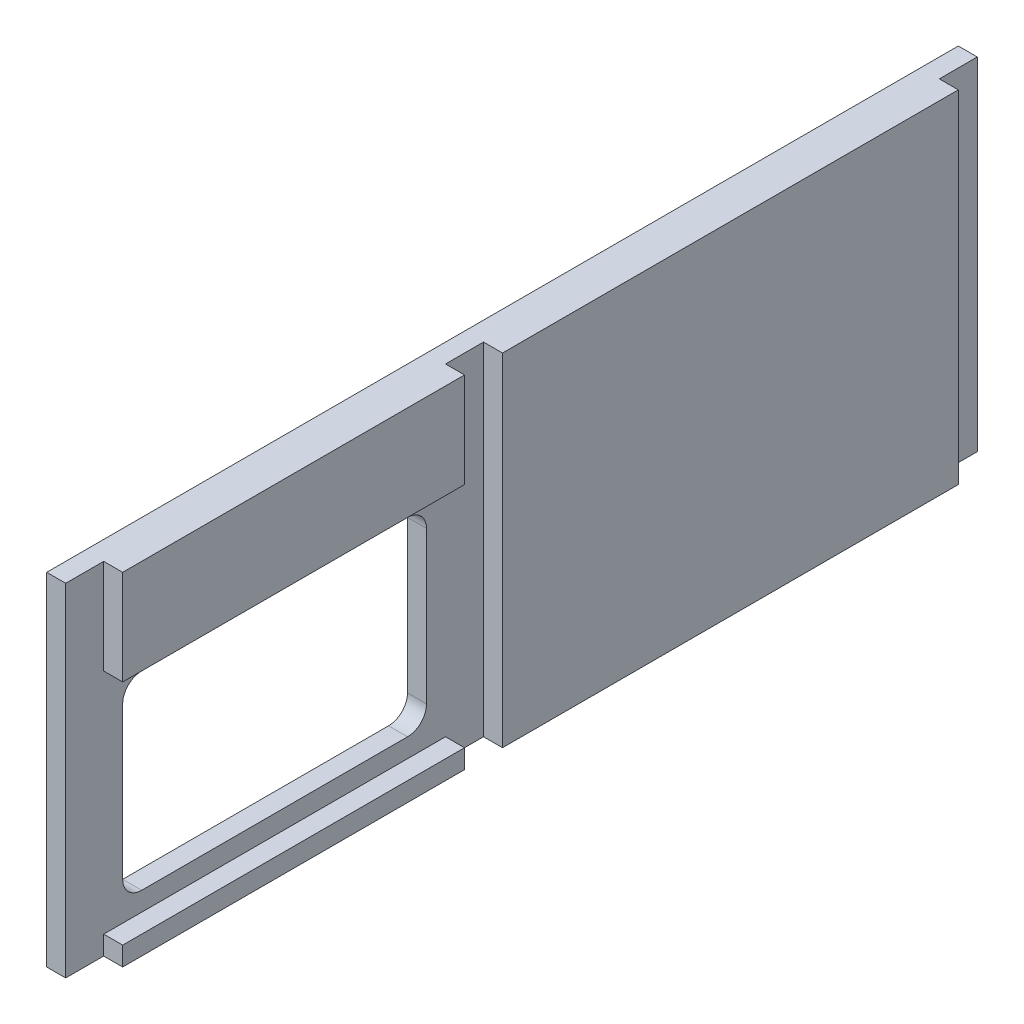
ISO-10303-21;
HEADER;
FILE_DESCRIPTION(('STEP AP214'),'2;1');
FILE_NAME('part.step','',(''),(''),'','','');
FILE_SCHEMA(('AUTOMOTIVE_DESIGN { 1 0 10303 214 1 1 1 1 }'));
ENDSEC;
DATA;
#1=APPLICATION_CONTEXT('core data for automotive mechanical design processes');
#2=APPLICATION_PROTOCOL_DEFINITION('international standard','automotive_design',2000,#1);
#3=PRODUCT_CONTEXT('',#1,'mechanical');
#4=PRODUCT('Part','Part','',(#3));
#5=PRODUCT_RELATED_PRODUCT_CATEGORY('part','',(#4));
#6=PRODUCT_DEFINITION_FORMATION('','',#4);
#7=PRODUCT_DEFINITION_CONTEXT('part definition',#1,'design');
#8=PRODUCT_DEFINITION('design','',#6,#7);
#9=PRODUCT_DEFINITION_SHAPE('','',#8);
#10=(LENGTH_UNIT() NAMED_UNIT(*) SI_UNIT(.MILLI.,.METRE.));
#11=(NAMED_UNIT(*) PLANE_ANGLE_UNIT() SI_UNIT($,.RADIAN.));
#12=(NAMED_UNIT(*) SI_UNIT($,.STERADIAN.) SOLID_ANGLE_UNIT());
#13=UNCERTAINTY_MEASURE_WITH_UNIT(LENGTH_MEASURE(1.E-05),#10,'distance_accuracy_value','');
#14=(GEOMETRIC_REPRESENTATION_CONTEXT(3) GLOBAL_UNCERTAINTY_ASSIGNED_CONTEXT((#13)) GLOBAL_UNIT_ASSIGNED_CONTEXT((#10,
#11,#12)) REPRESENTATION_CONTEXT('',''));
#15=CARTESIAN_POINT('',(0.,0.,0.));
#16=DIRECTION('',(0.,0.,1.));
#17=DIRECTION('',(1.,0.,0.));
#18=AXIS2_PLACEMENT_3D('',#15,#16,#17);
#19=CARTESIAN_POINT('',(12.7,0.,0.));
#20=DIRECTION('',(-1.,0.,0.));
#21=DIRECTION('',(0.,0.,1.));
#22=AXIS2_PLACEMENT_3D('',#19,#20,#21);
#23=PLANE('',#22);
#24=DIRECTION('',(0.,1.,0.));
#25=VECTOR('',#24,1.);
#26=CARTESIAN_POINT('',(12.7,114.3,-12.7));
#27=LINE('',#26,#25);
#28=CARTESIAN_POINT('',(12.7,82.55,-12.7));
#29=VERTEX_POINT('',#28);
#30=CARTESIAN_POINT('',(12.7,114.3,-12.7));
#31=VERTEX_POINT('',#30);
#32=EDGE_CURVE('E355',#29,#31,#27,.T.);
#33=ORIENTED_EDGE('',*,*,#32,.F.);
#34=DIRECTION('',(0.,0.,1.));
#35=VECTOR('',#34,1.);
#36=CARTESIAN_POINT('',(12.7,82.55,-12.7));
#37=LINE('',#36,#35);
#38=CARTESIAN_POINT('',(12.7,82.55,-127.));
#39=VERTEX_POINT('',#38);
#40=EDGE_CURVE('E272',#39,#29,#37,.T.);
#41=ORIENTED_EDGE('',*,*,#40,.F.);
#42=DIRECTION('',(0.,-1.,0.));
#43=VECTOR('',#42,1.);
#44=CARTESIAN_POINT('',(12.7,114.3,-127.));
#45=LINE('',#44,#43);
#46=CARTESIAN_POINT('',(12.7,114.3,-127.));
#47=VERTEX_POINT('',#46);
#48=EDGE_CURVE('E404',#47,#39,#45,.T.);
#49=ORIENTED_EDGE('',*,*,#48,.F.);
#50=DIRECTION('',(0.,0.,1.));
#51=VECTOR('',#50,1.);
#52=CARTESIAN_POINT('',(12.7,114.3,0.));
#53=LINE('',#52,#51);
#54=EDGE_CURVE('E288',#47,#31,#53,.T.);
#55=ORIENTED_EDGE('',*,*,#54,.T.);
#56=EDGE_LOOP('',(#33,#41,#49,#55));
#57=FACE_BOUND('',#56,.T.);
#58=ADVANCED_FACE('F40',(#57),#23,.F.);
#59=CARTESIAN_POINT('',(6.35,114.3,-12.7));
#60=DIRECTION('',(0.,0.,-1.));
#61=DIRECTION('',(0.,1.,0.));
#62=AXIS2_PLACEMENT_3D('',#59,#60,#61);
#63=PLANE('',#62);
#64=DIRECTION('',(0.,1.,0.));
#65=VECTOR('',#64,1.);
#66=CARTESIAN_POINT('',(6.35,114.3,-12.7));
#67=LINE('',#66,#65);
#68=CARTESIAN_POINT('',(6.35,82.55,-12.7));
#69=VERTEX_POINT('',#68);
#70=CARTESIAN_POINT('',(6.35,114.3,-12.7));
#71=VERTEX_POINT('',#70);
#72=EDGE_CURVE('E363',#69,#71,#67,.T.);
#73=ORIENTED_EDGE('',*,*,#72,.F.);
#74=DIRECTION('',(1.,0.,0.));
#75=VECTOR('',#74,1.);
#76=CARTESIAN_POINT('',(6.35,82.55,-12.7));
#77=LINE('',#76,#75);
#78=EDGE_CURVE('E279',#69,#29,#77,.T.);
#79=ORIENTED_EDGE('',*,*,#78,.T.);
#80=ORIENTED_EDGE('',*,*,#32,.T.);
#81=DIRECTION('',(1.,0.,0.));
#82=VECTOR('',#81,1.);
#83=CARTESIAN_POINT('',(6.35,114.3,-12.7));
#84=LINE('',#83,#82);
#85=EDGE_CURVE('E300',#71,#31,#84,.T.);
#86=ORIENTED_EDGE('',*,*,#85,.F.);
#87=EDGE_LOOP('',(#73,#79,#80,#86));
#88=FACE_BOUND('',#87,.T.);
#89=ADVANCED_FACE('F442',(#88),#63,.F.);
#90=CARTESIAN_POINT('',(6.35,114.3,-127.));
#91=DIRECTION('',(0.,0.,1.));
#92=DIRECTION('',(1.,0.,0.));
#93=AXIS2_PLACEMENT_3D('',#90,#91,#92);
#94=PLANE('',#93);
#95=ORIENTED_EDGE('',*,*,#48,.T.);
#96=DIRECTION('',(1.,0.,0.));
#97=VECTOR('',#96,1.);
#98=CARTESIAN_POINT('',(6.35,82.55,-127.));
#99=LINE('',#98,#97);
#100=CARTESIAN_POINT('',(6.35,82.55,-127.));
#101=VERTEX_POINT('',#100);
#102=EDGE_CURVE('E417',#101,#39,#99,.T.);
#103=ORIENTED_EDGE('',*,*,#102,.F.);
#104=DIRECTION('',(0.,-1.,0.));
#105=VECTOR('',#104,1.);
#106=CARTESIAN_POINT('',(6.35,114.3,-127.));
#107=LINE('',#106,#105);
#108=CARTESIAN_POINT('',(6.35,114.3,-127.));
#109=VERTEX_POINT('',#108);
#110=EDGE_CURVE('E411',#109,#101,#107,.T.);
#111=ORIENTED_EDGE('',*,*,#110,.F.);
#112=DIRECTION('',(1.,0.,0.));
#113=VECTOR('',#112,1.);
#114=CARTESIAN_POINT('',(6.35,114.3,-127.));
#115=LINE('',#114,#113);
#116=EDGE_CURVE('E351',#109,#47,#115,.T.);
#117=ORIENTED_EDGE('',*,*,#116,.T.);
#118=EDGE_LOOP('',(#95,#103,#111,#117));
#119=FACE_BOUND('',#118,.T.);
#120=ADVANCED_FACE('F438',(#119),#94,.F.);
#121=CARTESIAN_POINT('',(12.7,6.35,-127.));
#122=VERTEX_POINT('',#121);
#123=CARTESIAN_POINT('',(12.7,0.,-127.));
#124=VERTEX_POINT('',#123);
#125=EDGE_CURVE('E406',#122,#124,#45,.T.);
#126=ORIENTED_EDGE('',*,*,#125,.F.);
#127=DIRECTION('',(0.,0.,-1.));
#128=VECTOR('',#127,1.);
#129=CARTESIAN_POINT('',(12.7,6.35,-12.7));
#130=LINE('',#129,#128);
#131=CARTESIAN_POINT('',(12.7,6.35,-12.7));
#132=VERTEX_POINT('',#131);
#133=EDGE_CURVE('E257',#132,#122,#130,.T.);
#134=ORIENTED_EDGE('',*,*,#133,.F.);
#135=CARTESIAN_POINT('',(12.7,0.,-12.7));
#136=VERTEX_POINT('',#135);
#137=EDGE_CURVE('E360',#136,#132,#27,.T.);
#138=ORIENTED_EDGE('',*,*,#137,.F.);
#139=DIRECTION('',(0.,0.,-1.));
#140=VECTOR('',#139,1.);
#141=CARTESIAN_POINT('',(12.7,0.,0.));
#142=LINE('',#141,#140);
#143=EDGE_CURVE('E283',#136,#124,#142,.T.);
#144=ORIENTED_EDGE('',*,*,#143,.T.);
#145=EDGE_LOOP('',(#126,#134,#138,#144));
#146=FACE_BOUND('',#145,.T.);
#147=ADVANCED_FACE('F381',(#146),#23,.F.);
#148=CARTESIAN_POINT('',(12.7,0.,0.));
#149=DIRECTION('',(0.,0.,-1.));
#150=DIRECTION('',(-1.,0.,0.));
#151=AXIS2_PLACEMENT_3D('',#148,#149,#150);
#152=PLANE('',#151);
#153=DIRECTION('',(0.,-1.,0.));
#154=VECTOR('',#153,1.);
#155=CARTESIAN_POINT('',(6.35,114.3,0.));
#156=LINE('',#155,#154);
#157=CARTESIAN_POINT('',(6.35,114.3,0.));
#158=VERTEX_POINT('',#157);
#159=CARTESIAN_POINT('',(6.35,0.,0.));
#160=VERTEX_POINT('',#159);
#161=EDGE_CURVE('E357',#158,#160,#156,.T.);
#162=ORIENTED_EDGE('',*,*,#161,.F.);
#163=DIRECTION('',(-1.,0.,0.));
#164=VECTOR('',#163,1.);
#165=CARTESIAN_POINT('',(12.7,114.3,0.));
#166=LINE('',#165,#164);
#167=CARTESIAN_POINT('',(0.,114.3,0.));
#168=VERTEX_POINT('',#167);
#169=EDGE_CURVE('E295',#158,#168,#166,.T.);
#170=ORIENTED_EDGE('',*,*,#169,.T.);
#171=DIRECTION('',(0.,-1.,0.));
#172=VECTOR('',#171,1.);
#173=CARTESIAN_POINT('',(0.,0.,0.));
#174=LINE('',#173,#172);
#175=CARTESIAN_POINT('',(0.,0.,0.));
#176=VERTEX_POINT('',#175);
#177=EDGE_CURVE('E296',#168,#176,#174,.T.);
#178=ORIENTED_EDGE('',*,*,#177,.T.);
#179=DIRECTION('',(-1.,0.,0.));
#180=VECTOR('',#179,1.);
#181=CARTESIAN_POINT('',(12.7,0.,0.));
#182=LINE('',#181,#180);
#183=EDGE_CURVE('E12',#160,#176,#182,.T.);
#184=ORIENTED_EDGE('',*,*,#183,.F.);
#185=EDGE_LOOP('',(#162,#170,#178,#184));
#186=FACE_BOUND('',#185,.T.);
#187=ADVANCED_FACE('F42',(#186),#152,.F.);
#188=CARTESIAN_POINT('',(12.7,0.,0.));
#189=DIRECTION('',(0.,1.,0.));
#190=DIRECTION('',(0.,0.,1.));
#191=AXIS2_PLACEMENT_3D('',#188,#189,#190);
#192=PLANE('',#191);
#193=DIRECTION('',(0.,0.,-1.));
#194=VECTOR('',#193,1.);
#195=CARTESIAN_POINT('',(6.35,0.,-127.));
#196=LINE('',#195,#194);
#197=CARTESIAN_POINT('',(6.35,0.,-127.));
#198=VERTEX_POINT('',#197);
#199=CARTESIAN_POINT('',(6.35,0.,-139.7));
#200=VERTEX_POINT('',#199);
#201=EDGE_CURVE('E387',#198,#200,#196,.T.);
#202=ORIENTED_EDGE('',*,*,#201,.F.);
#203=DIRECTION('',(1.,0.,0.));
#204=VECTOR('',#203,1.);
#205=CARTESIAN_POINT('',(6.35,0.,-127.));
#206=LINE('',#205,#204);
#207=EDGE_CURVE('E384',#198,#124,#206,.T.);
#208=ORIENTED_EDGE('',*,*,#207,.T.);
#209=ORIENTED_EDGE('',*,*,#143,.F.);
#210=DIRECTION('',(1.,0.,0.));
#211=VECTOR('',#210,1.);
#212=CARTESIAN_POINT('',(6.35,0.,-12.7));
#213=LINE('',#212,#211);
#214=CARTESIAN_POINT('',(6.35,0.,-12.7));
#215=VERTEX_POINT('',#214);
#216=EDGE_CURVE('E290',#215,#136,#213,.T.);
#217=ORIENTED_EDGE('',*,*,#216,.F.);
#218=DIRECTION('',(0.,0.,-1.));
#219=VECTOR('',#218,1.);
#220=CARTESIAN_POINT('',(6.35,0.,0.));
#221=LINE('',#220,#219);
#222=EDGE_CURVE('E359',#160,#215,#221,.T.);
#223=ORIENTED_EDGE('',*,*,#222,.F.);
#224=ORIENTED_EDGE('',*,*,#183,.T.);
#225=DIRECTION('',(0.,0.,-1.));
#226=VECTOR('',#225,1.);
#227=CARTESIAN_POINT('',(0.,0.,0.));
#228=LINE('',#227,#226);
#229=CARTESIAN_POINT('',(0.,0.,-304.8));
#230=VERTEX_POINT('',#229);
#231=EDGE_CURVE('E299',#176,#230,#228,.T.);
#232=ORIENTED_EDGE('',*,*,#231,.T.);
#233=DIRECTION('',(-1.,0.,0.));
#234=VECTOR('',#233,1.);
#235=CARTESIAN_POINT('',(12.7,0.,-304.8));
#236=LINE('',#235,#234);
#237=CARTESIAN_POINT('',(6.35,0.,-304.8));
#238=VERTEX_POINT('',#237);
#239=EDGE_CURVE('E48',#238,#230,#236,.T.);
#240=ORIENTED_EDGE('',*,*,#239,.F.);
#241=DIRECTION('',(0.,0.,-1.));
#242=VECTOR('',#241,1.);
#243=CARTESIAN_POINT('',(6.35,0.,-304.8));
#244=LINE('',#243,#242);
#245=CARTESIAN_POINT('',(6.35,0.,-292.1));
#246=VERTEX_POINT('',#245);
#247=EDGE_CURVE('E342',#246,#238,#244,.T.);
#248=ORIENTED_EDGE('',*,*,#247,.F.);
#249=DIRECTION('',(1.,0.,0.));
#250=VECTOR('',#249,1.);
#251=CARTESIAN_POINT('',(6.35,0.,-292.1));
#252=LINE('',#251,#250);
#253=CARTESIAN_POINT('',(12.7,0.,-292.1));
#254=VERTEX_POINT('',#253);
#255=EDGE_CURVE('E352',#246,#254,#252,.T.);
#256=ORIENTED_EDGE('',*,*,#255,.T.);
#257=CARTESIAN_POINT('',(12.7,0.,-139.7));
#258=VERTEX_POINT('',#257);
#259=EDGE_CURVE('E289',#258,#254,#142,.T.);
#260=ORIENTED_EDGE('',*,*,#259,.F.);
#261=DIRECTION('',(1.,0.,0.));
#262=VECTOR('',#261,1.);
#263=CARTESIAN_POINT('',(6.35,0.,-139.7));
#264=LINE('',#263,#262);
#265=EDGE_CURVE('E390',#200,#258,#264,.T.);
#266=ORIENTED_EDGE('',*,*,#265,.F.);
#267=EDGE_LOOP('',(#202,#208,#209,#217,#223,#224,#232,#240,#248,#256,#260,#266));
#268=FACE_BOUND('',#267,.T.);
#269=ADVANCED_FACE('F323',(#268),#192,.F.);
#270=CARTESIAN_POINT('',(12.7,0.,-304.8));
#271=DIRECTION('',(0.,0.,1.));
#272=DIRECTION('',(1.,0.,0.));
#273=AXIS2_PLACEMENT_3D('',#270,#271,#272);
#274=PLANE('',#273);
#275=DIRECTION('',(-1.,0.,0.));
#276=VECTOR('',#275,1.);
#277=CARTESIAN_POINT('',(12.7,114.3,-304.8));
#278=LINE('',#277,#276);
#279=CARTESIAN_POINT('',(6.35,114.3,-304.8));
#280=VERTEX_POINT('',#279);
#281=CARTESIAN_POINT('',(0.,114.3,-304.8));
#282=VERTEX_POINT('',#281);
#283=EDGE_CURVE('E310',#280,#282,#278,.T.);
#284=ORIENTED_EDGE('',*,*,#283,.F.);
#285=DIRECTION('',(0.,1.,0.));
#286=VECTOR('',#285,1.);
#287=CARTESIAN_POINT('',(6.35,114.3,-304.8));
#288=LINE('',#287,#286);
#289=EDGE_CURVE('E318',#238,#280,#288,.T.);
#290=ORIENTED_EDGE('',*,*,#289,.F.);
#291=ORIENTED_EDGE('',*,*,#239,.T.);
#292=DIRECTION('',(0.,1.,0.));
#293=VECTOR('',#292,1.);
#294=CARTESIAN_POINT('',(0.,0.,-304.8));
#295=LINE('',#294,#293);
#296=EDGE_CURVE('E303',#230,#282,#295,.T.);
#297=ORIENTED_EDGE('',*,*,#296,.T.);
#298=EDGE_LOOP('',(#284,#290,#291,#297));
#299=FACE_BOUND('',#298,.T.);
#300=ADVANCED_FACE('F315',(#299),#274,.F.);
#301=CARTESIAN_POINT('',(12.7,114.3,0.));
#302=DIRECTION('',(0.,-1.,0.));
#303=DIRECTION('',(0.,0.,-1.));
#304=AXIS2_PLACEMENT_3D('',#301,#302,#303);
#305=PLANE('',#304);
#306=ORIENTED_EDGE('',*,*,#54,.F.);
#307=ORIENTED_EDGE('',*,*,#116,.F.);
#308=DIRECTION('',(0.,0.,1.));
#309=VECTOR('',#308,1.);
#310=CARTESIAN_POINT('',(6.35,114.3,-127.));
#311=LINE('',#310,#309);
#312=CARTESIAN_POINT('',(6.35,114.3,-139.7));
#313=VERTEX_POINT('',#312);
#314=EDGE_CURVE('E391',#313,#109,#311,.T.);
#315=ORIENTED_EDGE('',*,*,#314,.F.);
#316=DIRECTION('',(1.,0.,0.));
#317=VECTOR('',#316,1.);
#318=CARTESIAN_POINT('',(6.35,114.3,-139.7));
#319=LINE('',#318,#317);
#320=CARTESIAN_POINT('',(12.7,114.3,-139.7));
#321=VERTEX_POINT('',#320);
#322=EDGE_CURVE('E392',#313,#321,#319,.T.);
#323=ORIENTED_EDGE('',*,*,#322,.T.);
#324=CARTESIAN_POINT('',(12.7,114.3,-292.1));
#325=VERTEX_POINT('',#324);
#326=EDGE_CURVE('E292',#325,#321,#53,.T.);
#327=ORIENTED_EDGE('',*,*,#326,.F.);
#328=DIRECTION('',(1.,0.,0.));
#329=VECTOR('',#328,1.);
#330=CARTESIAN_POINT('',(6.35,114.3,-292.1));
#331=LINE('',#330,#329);
#332=CARTESIAN_POINT('',(6.35,114.3,-292.1));
#333=VERTEX_POINT('',#332);
#334=EDGE_CURVE('E337',#333,#325,#331,.T.);
#335=ORIENTED_EDGE('',*,*,#334,.F.);
#336=DIRECTION('',(0.,0.,1.));
#337=VECTOR('',#336,1.);
#338=CARTESIAN_POINT('',(6.35,114.3,-304.8));
#339=LINE('',#338,#337);
#340=EDGE_CURVE('E335',#280,#333,#339,.T.);
#341=ORIENTED_EDGE('',*,*,#340,.F.);
#342=ORIENTED_EDGE('',*,*,#283,.T.);
#343=DIRECTION('',(0.,0.,1.));
#344=VECTOR('',#343,1.);
#345=CARTESIAN_POINT('',(0.,114.3,0.));
#346=LINE('',#345,#344);
#347=EDGE_CURVE('E306',#282,#168,#346,.T.);
#348=ORIENTED_EDGE('',*,*,#347,.T.);
#349=ORIENTED_EDGE('',*,*,#169,.F.);
#350=DIRECTION('',(0.,0.,1.));
#351=VECTOR('',#350,1.);
#352=CARTESIAN_POINT('',(6.35,114.3,0.));
#353=LINE('',#352,#351);
#354=EDGE_CURVE('E367',#71,#158,#353,.T.);
#355=ORIENTED_EDGE('',*,*,#354,.F.);
#356=ORIENTED_EDGE('',*,*,#85,.T.);
#357=EDGE_LOOP('',(#306,#307,#315,#323,#327,#335,#341,#342,#348,#349,#355,#356));
#358=FACE_BOUND('',#357,.T.);
#359=ADVANCED_FACE('F330',(#358),#305,.F.);
#360=ORIENTED_EDGE('',*,*,#326,.T.);
#361=DIRECTION('',(0.,1.,0.));
#362=VECTOR('',#361,1.);
#363=CARTESIAN_POINT('',(12.7,114.3,-139.7));
#364=LINE('',#363,#362);
#365=EDGE_CURVE('E401',#258,#321,#364,.T.);
#366=ORIENTED_EDGE('',*,*,#365,.F.);
#367=ORIENTED_EDGE('',*,*,#259,.T.);
#368=DIRECTION('',(0.,-1.,0.));
#369=VECTOR('',#368,1.);
#370=CARTESIAN_POINT('',(12.7,114.3,-292.1));
#371=LINE('',#370,#369);
#372=EDGE_CURVE('E344',#325,#254,#371,.T.);
#373=ORIENTED_EDGE('',*,*,#372,.F.);
#374=EDGE_LOOP('',(#360,#366,#367,#373));
#375=FACE_BOUND('',#374,.T.);
#376=ADVANCED_FACE('F440',(#375),#23,.F.);
#377=CARTESIAN_POINT('',(0.,0.,0.));
#378=DIRECTION('',(-1.,0.,0.));
#379=DIRECTION('',(0.,0.,1.));
#380=AXIS2_PLACEMENT_3D('',#377,#378,#379);
#381=PLANE('',#380);
#382=CARTESIAN_POINT('',(0.,19.05,-25.4));
#383=DIRECTION('',(1.,0.,0.));
#384=DIRECTION('',(0.,0.,-1.));
#385=AXIS2_PLACEMENT_3D('',#382,#383,#384);
#386=CIRCLE('',#385,6.35);
#387=CARTESIAN_POINT('',(0.,19.05,-19.05));
#388=VERTEX_POINT('',#387);
#389=CARTESIAN_POINT('',(0.,12.7,-25.4));
#390=VERTEX_POINT('',#389);
#391=EDGE_CURVE('E202',#388,#390,#386,.T.);
#392=ORIENTED_EDGE('',*,*,#391,.T.);
#393=DIRECTION('',(0.,0.,-1.));
#394=VECTOR('',#393,1.);
#395=CARTESIAN_POINT('',(0.,12.7,-25.4));
#396=LINE('',#395,#394);
#397=CARTESIAN_POINT('',(0.,12.7,-114.3));
#398=VERTEX_POINT('',#397);
#399=EDGE_CURVE('E211',#390,#398,#396,.T.);
#400=ORIENTED_EDGE('',*,*,#399,.T.);
#401=CARTESIAN_POINT('',(0.,19.05,-114.3));
#402=DIRECTION('',(1.,0.,0.));
#403=DIRECTION('',(0.,0.,-1.));
#404=AXIS2_PLACEMENT_3D('',#401,#402,#403);
#405=CIRCLE('',#404,6.35);
#406=CARTESIAN_POINT('',(0.,19.05,-120.65));
#407=VERTEX_POINT('',#406);
#408=EDGE_CURVE('E55',#398,#407,#405,.T.);
#409=ORIENTED_EDGE('',*,*,#408,.T.);
#410=DIRECTION('',(0.,1.,0.));
#411=VECTOR('',#410,1.);
#412=CARTESIAN_POINT('',(0.,69.85,-120.65));
#413=LINE('',#412,#411);
#414=CARTESIAN_POINT('',(0.,69.85,-120.65));
#415=VERTEX_POINT('',#414);
#416=EDGE_CURVE('E226',#407,#415,#413,.T.);
#417=ORIENTED_EDGE('',*,*,#416,.T.);
#418=CARTESIAN_POINT('',(0.,69.85,-114.3));
#419=DIRECTION('',(1.,0.,0.));
#420=DIRECTION('',(0.,0.,-1.));
#421=AXIS2_PLACEMENT_3D('',#418,#419,#420);
#422=CIRCLE('',#421,6.35);
#423=CARTESIAN_POINT('',(0.,76.2,-114.3));
#424=VERTEX_POINT('',#423);
#425=EDGE_CURVE('E229',#415,#424,#422,.T.);
#426=ORIENTED_EDGE('',*,*,#425,.T.);
#427=DIRECTION('',(0.,0.,1.));
#428=VECTOR('',#427,1.);
#429=CARTESIAN_POINT('',(0.,76.2,-25.4));
#430=LINE('',#429,#428);
#431=CARTESIAN_POINT('',(0.,76.2,-25.4));
#432=VERTEX_POINT('',#431);
#433=EDGE_CURVE('E232',#424,#432,#430,.T.);
#434=ORIENTED_EDGE('',*,*,#433,.T.);
#435=CARTESIAN_POINT('',(0.,69.85,-25.4));
#436=DIRECTION('',(1.,0.,0.));
#437=DIRECTION('',(0.,0.,1.));
#438=AXIS2_PLACEMENT_3D('',#435,#436,#437);
#439=CIRCLE('',#438,6.35);
#440=CARTESIAN_POINT('',(0.,69.85,-19.05));
#441=VERTEX_POINT('',#440);
#442=EDGE_CURVE('E235',#432,#441,#439,.T.);
#443=ORIENTED_EDGE('',*,*,#442,.T.);
#444=DIRECTION('',(0.,-1.,0.));
#445=VECTOR('',#444,1.);
#446=CARTESIAN_POINT('',(0.,69.85,-19.05));
#447=LINE('',#446,#445);
#448=EDGE_CURVE('E208',#441,#388,#447,.T.);
#449=ORIENTED_EDGE('',*,*,#448,.T.);
#450=EDGE_LOOP('',(#392,#400,#409,#417,#426,#434,#443,#449));
#451=FACE_BOUND('',#450,.T.);
#452=ORIENTED_EDGE('',*,*,#177,.F.);
#453=ORIENTED_EDGE('',*,*,#347,.F.);
#454=ORIENTED_EDGE('',*,*,#296,.F.);
#455=ORIENTED_EDGE('',*,*,#231,.F.);
#456=EDGE_LOOP('',(#452,#453,#454,#455));
#457=FACE_BOUND('',#456,.T.);
#458=ADVANCED_FACE('F215',(#451,#457),#381,.T.);
#459=ORIENTED_EDGE('',*,*,#137,.T.);
#460=DIRECTION('',(1.,0.,0.));
#461=VECTOR('',#460,1.);
#462=CARTESIAN_POINT('',(6.35,6.35,-12.7));
#463=LINE('',#462,#461);
#464=CARTESIAN_POINT('',(6.35,6.35,-12.7));
#465=VERTEX_POINT('',#464);
#466=EDGE_CURVE('E274',#465,#132,#463,.T.);
#467=ORIENTED_EDGE('',*,*,#466,.F.);
#468=EDGE_CURVE('E364',#215,#465,#67,.T.);
#469=ORIENTED_EDGE('',*,*,#468,.F.);
#470=ORIENTED_EDGE('',*,*,#216,.T.);
#471=EDGE_LOOP('',(#459,#467,#469,#470));
#472=FACE_BOUND('',#471,.T.);
#473=ADVANCED_FACE('F375',(#472),#63,.F.);
#474=CARTESIAN_POINT('',(6.35,0.,0.));
#475=DIRECTION('',(1.,0.,0.));
#476=DIRECTION('',(0.,0.,-1.));
#477=AXIS2_PLACEMENT_3D('',#474,#475,#476);
#478=PLANE('',#477);
#479=CARTESIAN_POINT('',(6.35,19.05,-25.4));
#480=DIRECTION('',(1.,0.,0.));
#481=DIRECTION('',(0.,0.,-1.));
#482=AXIS2_PLACEMENT_3D('',#479,#480,#481);
#483=CIRCLE('',#482,6.35);
#484=CARTESIAN_POINT('',(6.35,19.05,-19.05));
#485=VERTEX_POINT('',#484);
#486=CARTESIAN_POINT('',(6.35,12.7,-25.4));
#487=VERTEX_POINT('',#486);
#488=EDGE_CURVE('E63',#485,#487,#483,.T.);
#489=ORIENTED_EDGE('',*,*,#488,.F.);
#490=DIRECTION('',(0.,-1.,0.));
#491=VECTOR('',#490,1.);
#492=CARTESIAN_POINT('',(6.35,69.85,-19.05));
#493=LINE('',#492,#491);
#494=CARTESIAN_POINT('',(6.35,69.85,-19.05));
#495=VERTEX_POINT('',#494);
#496=EDGE_CURVE('E219',#495,#485,#493,.T.);
#497=ORIENTED_EDGE('',*,*,#496,.F.);
#498=CARTESIAN_POINT('',(6.35,69.85,-25.4));
#499=DIRECTION('',(1.,0.,0.));
#500=DIRECTION('',(0.,0.,1.));
#501=AXIS2_PLACEMENT_3D('',#498,#499,#500);
#502=CIRCLE('',#501,6.35);
#503=CARTESIAN_POINT('',(6.35,76.2,-25.4));
#504=VERTEX_POINT('',#503);
#505=EDGE_CURVE('E222',#504,#495,#502,.T.);
#506=ORIENTED_EDGE('',*,*,#505,.F.);
#507=DIRECTION('',(0.,0.,1.));
#508=VECTOR('',#507,1.);
#509=CARTESIAN_POINT('',(6.35,76.2,-25.4));
#510=LINE('',#509,#508);
#511=CARTESIAN_POINT('',(6.35,76.2,-114.3));
#512=VERTEX_POINT('',#511);
#513=EDGE_CURVE('E250',#512,#504,#510,.T.);
#514=ORIENTED_EDGE('',*,*,#513,.F.);
#515=CARTESIAN_POINT('',(6.35,69.85,-114.3));
#516=DIRECTION('',(1.,0.,0.));
#517=DIRECTION('',(0.,0.,-1.));
#518=AXIS2_PLACEMENT_3D('',#515,#516,#517);
#519=CIRCLE('',#518,6.35);
#520=CARTESIAN_POINT('',(6.35,69.85,-120.65));
#521=VERTEX_POINT('',#520);
#522=EDGE_CURVE('E247',#521,#512,#519,.T.);
#523=ORIENTED_EDGE('',*,*,#522,.F.);
#524=DIRECTION('',(0.,1.,0.));
#525=VECTOR('',#524,1.);
#526=CARTESIAN_POINT('',(6.35,69.85,-120.65));
#527=LINE('',#526,#525);
#528=CARTESIAN_POINT('',(6.35,19.05,-120.65));
#529=VERTEX_POINT('',#528);
#530=EDGE_CURVE('E244',#529,#521,#527,.T.);
#531=ORIENTED_EDGE('',*,*,#530,.F.);
#532=CARTESIAN_POINT('',(6.35,19.05,-114.3));
#533=DIRECTION('',(1.,0.,0.));
#534=DIRECTION('',(0.,0.,-1.));
#535=AXIS2_PLACEMENT_3D('',#532,#533,#534);
#536=CIRCLE('',#535,6.35);
#537=CARTESIAN_POINT('',(6.35,12.7,-114.3));
#538=VERTEX_POINT('',#537);
#539=EDGE_CURVE('E241',#538,#529,#536,.T.);
#540=ORIENTED_EDGE('',*,*,#539,.F.);
#541=DIRECTION('',(0.,0.,-1.));
#542=VECTOR('',#541,1.);
#543=CARTESIAN_POINT('',(6.35,12.7,-25.4));
#544=LINE('',#543,#542);
#545=EDGE_CURVE('E239',#487,#538,#544,.T.);
#546=ORIENTED_EDGE('',*,*,#545,.F.);
#547=EDGE_LOOP('',(#489,#497,#506,#514,#523,#531,#540,#546));
#548=FACE_BOUND('',#547,.T.);
#549=ORIENTED_EDGE('',*,*,#161,.T.);
#550=ORIENTED_EDGE('',*,*,#222,.T.);
#551=ORIENTED_EDGE('',*,*,#468,.T.);
#552=DIRECTION('',(0.,0.,-1.));
#553=VECTOR('',#552,1.);
#554=CARTESIAN_POINT('',(6.35,6.35,-12.7));
#555=LINE('',#554,#553);
#556=CARTESIAN_POINT('',(6.35,6.35000000000001,-127.));
#557=VERTEX_POINT('',#556);
#558=EDGE_CURVE('E269',#465,#557,#555,.T.);
#559=ORIENTED_EDGE('',*,*,#558,.T.);
#560=EDGE_CURVE('E403',#557,#198,#107,.T.);
#561=ORIENTED_EDGE('',*,*,#560,.T.);
#562=ORIENTED_EDGE('',*,*,#201,.T.);
#563=DIRECTION('',(0.,1.,0.));
#564=VECTOR('',#563,1.);
#565=CARTESIAN_POINT('',(6.35,114.3,-139.7));
#566=LINE('',#565,#564);
#567=EDGE_CURVE('E395',#200,#313,#566,.T.);
#568=ORIENTED_EDGE('',*,*,#567,.T.);
#569=ORIENTED_EDGE('',*,*,#314,.T.);
#570=ORIENTED_EDGE('',*,*,#110,.T.);
#571=DIRECTION('',(0.,0.,1.));
#572=VECTOR('',#571,1.);
#573=CARTESIAN_POINT('',(6.35,82.55,-12.7));
#574=LINE('',#573,#572);
#575=EDGE_CURVE('E271',#101,#69,#574,.T.);
#576=ORIENTED_EDGE('',*,*,#575,.T.);
#577=ORIENTED_EDGE('',*,*,#72,.T.);
#578=ORIENTED_EDGE('',*,*,#354,.T.);
#579=EDGE_LOOP('',(#549,#550,#551,#559,#561,#562,#568,#569,#570,#576,#577,#578));
#580=FACE_BOUND('',#579,.T.);
#581=ADVANCED_FACE('F430',(#548,#580),#478,.T.);
#582=CARTESIAN_POINT('',(6.35,114.3,-292.1));
#583=DIRECTION('',(0.,0.,1.));
#584=DIRECTION('',(1.,0.,0.));
#585=AXIS2_PLACEMENT_3D('',#582,#583,#584);
#586=PLANE('',#585);
#587=ORIENTED_EDGE('',*,*,#372,.T.);
#588=ORIENTED_EDGE('',*,*,#255,.F.);
#589=DIRECTION('',(0.,-1.,0.));
#590=VECTOR('',#589,1.);
#591=CARTESIAN_POINT('',(6.35,114.3,-292.1));
#592=LINE('',#591,#590);
#593=EDGE_CURVE('E340',#333,#246,#592,.T.);
#594=ORIENTED_EDGE('',*,*,#593,.F.);
#595=ORIENTED_EDGE('',*,*,#334,.T.);
#596=EDGE_LOOP('',(#587,#588,#594,#595));
#597=FACE_BOUND('',#596,.T.);
#598=ADVANCED_FACE('F464',(#597),#586,.F.);
#599=CARTESIAN_POINT('',(6.35,0.,0.));
#600=DIRECTION('',(-1.,0.,0.));
#601=DIRECTION('',(0.,0.,1.));
#602=AXIS2_PLACEMENT_3D('',#599,#600,#601);
#603=PLANE('',#602);
#604=ORIENTED_EDGE('',*,*,#289,.T.);
#605=ORIENTED_EDGE('',*,*,#340,.T.);
#606=ORIENTED_EDGE('',*,*,#593,.T.);
#607=ORIENTED_EDGE('',*,*,#247,.T.);
#608=EDGE_LOOP('',(#604,#605,#606,#607));
#609=FACE_BOUND('',#608,.T.);
#610=ADVANCED_FACE('F465',(#609),#603,.F.);
#611=ORIENTED_EDGE('',*,*,#560,.F.);
#612=DIRECTION('',(1.,0.,0.));
#613=VECTOR('',#612,1.);
#614=CARTESIAN_POINT('',(6.35,6.35,-127.));
#615=LINE('',#614,#613);
#616=EDGE_CURVE('E415',#557,#122,#615,.T.);
#617=ORIENTED_EDGE('',*,*,#616,.T.);
#618=ORIENTED_EDGE('',*,*,#125,.T.);
#619=ORIENTED_EDGE('',*,*,#207,.F.);
#620=EDGE_LOOP('',(#611,#617,#618,#619));
#621=FACE_BOUND('',#620,.T.);
#622=ADVANCED_FACE('F425',(#621),#94,.F.);
#623=CARTESIAN_POINT('',(6.35,114.3,-139.7));
#624=DIRECTION('',(0.,0.,-1.));
#625=DIRECTION('',(0.,1.,0.));
#626=AXIS2_PLACEMENT_3D('',#623,#624,#625);
#627=PLANE('',#626);
#628=ORIENTED_EDGE('',*,*,#365,.T.);
#629=ORIENTED_EDGE('',*,*,#322,.F.);
#630=ORIENTED_EDGE('',*,*,#567,.F.);
#631=ORIENTED_EDGE('',*,*,#265,.T.);
#632=EDGE_LOOP('',(#628,#629,#630,#631));
#633=FACE_BOUND('',#632,.T.);
#634=ADVANCED_FACE('F462',(#633),#627,.F.);
#635=CARTESIAN_POINT('',(6.35,82.55,-12.7));
#636=DIRECTION('',(0.,1.,0.));
#637=DIRECTION('',(0.,0.,1.));
#638=AXIS2_PLACEMENT_3D('',#635,#636,#637);
#639=PLANE('',#638);
#640=ORIENTED_EDGE('',*,*,#40,.T.);
#641=ORIENTED_EDGE('',*,*,#78,.F.);
#642=ORIENTED_EDGE('',*,*,#575,.F.);
#643=ORIENTED_EDGE('',*,*,#102,.T.);
#644=EDGE_LOOP('',(#640,#641,#642,#643));
#645=FACE_BOUND('',#644,.T.);
#646=ADVANCED_FACE('F511',(#645),#639,.F.);
#647=CARTESIAN_POINT('',(6.35,6.35,-12.7));
#648=DIRECTION('',(0.,-1.,0.));
#649=DIRECTION('',(0.,0.,-1.));
#650=AXIS2_PLACEMENT_3D('',#647,#648,#649);
#651=PLANE('',#650);
#652=ORIENTED_EDGE('',*,*,#133,.T.);
#653=ORIENTED_EDGE('',*,*,#616,.F.);
#654=ORIENTED_EDGE('',*,*,#558,.F.);
#655=ORIENTED_EDGE('',*,*,#466,.T.);
#656=EDGE_LOOP('',(#652,#653,#654,#655));
#657=FACE_BOUND('',#656,.T.);
#658=ADVANCED_FACE('F428',(#657),#651,.F.);
#659=CARTESIAN_POINT('',(0.,19.05,-25.4));
#660=DIRECTION('',(1.,0.,0.));
#661=DIRECTION('',(0.,0.,-1.));
#662=AXIS2_PLACEMENT_3D('',#659,#660,#661);
#663=CYLINDRICAL_SURFACE('',#662,6.35);
#664=ORIENTED_EDGE('',*,*,#488,.T.);
#665=DIRECTION('',(1.,0.,0.));
#666=VECTOR('',#665,1.);
#667=CARTESIAN_POINT('',(0.,12.7,-25.4));
#668=LINE('',#667,#666);
#669=EDGE_CURVE('E198',#390,#487,#668,.T.);
#670=ORIENTED_EDGE('',*,*,#669,.F.);
#671=ORIENTED_EDGE('',*,*,#391,.F.);
#672=DIRECTION('',(1.,0.,0.));
#673=VECTOR('',#672,1.);
#674=CARTESIAN_POINT('',(0.,19.05,-19.05));
#675=LINE('',#674,#673);
#676=EDGE_CURVE('E255',#388,#485,#675,.T.);
#677=ORIENTED_EDGE('',*,*,#676,.T.);
#678=EDGE_LOOP('',(#664,#670,#671,#677));
#679=FACE_BOUND('',#678,.T.);
#680=ADVANCED_FACE('F200',(#679),#663,.F.);
#681=CARTESIAN_POINT('',(0.,69.85,-19.05));
#682=DIRECTION('',(0.,0.,1.));
#683=DIRECTION('',(0.,-1.,0.));
#684=AXIS2_PLACEMENT_3D('',#681,#682,#683);
#685=PLANE('',#684);
#686=ORIENTED_EDGE('',*,*,#496,.T.);
#687=ORIENTED_EDGE('',*,*,#676,.F.);
#688=ORIENTED_EDGE('',*,*,#448,.F.);
#689=DIRECTION('',(1.,0.,0.));
#690=VECTOR('',#689,1.);
#691=CARTESIAN_POINT('',(0.,69.85,-19.05));
#692=LINE('',#691,#690);
#693=EDGE_CURVE('E258',#441,#495,#692,.T.);
#694=ORIENTED_EDGE('',*,*,#693,.T.);
#695=EDGE_LOOP('',(#686,#687,#688,#694));
#696=FACE_BOUND('',#695,.T.);
#697=ADVANCED_FACE('F570',(#696),#685,.F.);
#698=CARTESIAN_POINT('',(0.,69.85,-25.4));
#699=DIRECTION('',(1.,0.,0.));
#700=DIRECTION('',(0.,0.,-1.));
#701=AXIS2_PLACEMENT_3D('',#698,#699,#700);
#702=CYLINDRICAL_SURFACE('',#701,6.35);
#703=ORIENTED_EDGE('',*,*,#505,.T.);
#704=ORIENTED_EDGE('',*,*,#693,.F.);
#705=ORIENTED_EDGE('',*,*,#442,.F.);
#706=DIRECTION('',(1.,0.,0.));
#707=VECTOR('',#706,1.);
#708=CARTESIAN_POINT('',(0.,76.2,-25.4));
#709=LINE('',#708,#707);
#710=EDGE_CURVE('E260',#432,#504,#709,.T.);
#711=ORIENTED_EDGE('',*,*,#710,.T.);
#712=EDGE_LOOP('',(#703,#704,#705,#711));
#713=FACE_BOUND('',#712,.T.);
#714=ADVANCED_FACE('F578',(#713),#702,.F.);
#715=CARTESIAN_POINT('',(0.,76.2,-25.4));
#716=DIRECTION('',(0.,1.,0.));
#717=DIRECTION('',(0.,0.,1.));
#718=AXIS2_PLACEMENT_3D('',#715,#716,#717);
#719=PLANE('',#718);
#720=ORIENTED_EDGE('',*,*,#513,.T.);
#721=ORIENTED_EDGE('',*,*,#710,.F.);
#722=ORIENTED_EDGE('',*,*,#433,.F.);
#723=DIRECTION('',(1.,0.,0.));
#724=VECTOR('',#723,1.);
#725=CARTESIAN_POINT('',(0.,76.2,-114.3));
#726=LINE('',#725,#724);
#727=EDGE_CURVE('E262',#424,#512,#726,.T.);
#728=ORIENTED_EDGE('',*,*,#727,.T.);
#729=EDGE_LOOP('',(#720,#721,#722,#728));
#730=FACE_BOUND('',#729,.T.);
#731=ADVANCED_FACE('F587',(#730),#719,.F.);
#732=CARTESIAN_POINT('',(0.,69.85,-114.3));
#733=DIRECTION('',(1.,0.,0.));
#734=DIRECTION('',(0.,0.,-1.));
#735=AXIS2_PLACEMENT_3D('',#732,#733,#734);
#736=CYLINDRICAL_SURFACE('',#735,6.35);
#737=ORIENTED_EDGE('',*,*,#522,.T.);
#738=ORIENTED_EDGE('',*,*,#727,.F.);
#739=ORIENTED_EDGE('',*,*,#425,.F.);
#740=DIRECTION('',(1.,0.,0.));
#741=VECTOR('',#740,1.);
#742=CARTESIAN_POINT('',(0.,69.85,-120.65));
#743=LINE('',#742,#741);
#744=EDGE_CURVE('E264',#415,#521,#743,.T.);
#745=ORIENTED_EDGE('',*,*,#744,.T.);
#746=EDGE_LOOP('',(#737,#738,#739,#745));
#747=FACE_BOUND('',#746,.T.);
#748=ADVANCED_FACE('F596',(#747),#736,.F.);
#749=CARTESIAN_POINT('',(0.,69.85,-120.65));
#750=DIRECTION('',(0.,0.,-1.));
#751=DIRECTION('',(0.,1.,0.));
#752=AXIS2_PLACEMENT_3D('',#749,#750,#751);
#753=PLANE('',#752);
#754=ORIENTED_EDGE('',*,*,#530,.T.);
#755=ORIENTED_EDGE('',*,*,#744,.F.);
#756=ORIENTED_EDGE('',*,*,#416,.F.);
#757=DIRECTION('',(1.,0.,0.));
#758=VECTOR('',#757,1.);
#759=CARTESIAN_POINT('',(0.,19.05,-120.65));
#760=LINE('',#759,#758);
#761=EDGE_CURVE('E266',#407,#529,#760,.T.);
#762=ORIENTED_EDGE('',*,*,#761,.T.);
#763=EDGE_LOOP('',(#754,#755,#756,#762));
#764=FACE_BOUND('',#763,.T.);
#765=ADVANCED_FACE('F605',(#764),#753,.F.);
#766=CARTESIAN_POINT('',(0.,19.05,-114.3));
#767=DIRECTION('',(1.,0.,0.));
#768=DIRECTION('',(0.,0.,-1.));
#769=AXIS2_PLACEMENT_3D('',#766,#767,#768);
#770=CYLINDRICAL_SURFACE('',#769,6.35);
#771=ORIENTED_EDGE('',*,*,#539,.T.);
#772=ORIENTED_EDGE('',*,*,#761,.F.);
#773=ORIENTED_EDGE('',*,*,#408,.F.);
#774=DIRECTION('',(1.,0.,0.));
#775=VECTOR('',#774,1.);
#776=CARTESIAN_POINT('',(0.,12.7,-114.3));
#777=LINE('',#776,#775);
#778=EDGE_CURVE('E207',#398,#538,#777,.T.);
#779=ORIENTED_EDGE('',*,*,#778,.T.);
#780=EDGE_LOOP('',(#771,#772,#773,#779));
#781=FACE_BOUND('',#780,.T.);
#782=ADVANCED_FACE('F614',(#781),#770,.F.);
#783=CARTESIAN_POINT('',(0.,12.7,-25.4));
#784=DIRECTION('',(0.,-1.,0.));
#785=DIRECTION('',(0.,0.,-1.));
#786=AXIS2_PLACEMENT_3D('',#783,#784,#785);
#787=PLANE('',#786);
#788=ORIENTED_EDGE('',*,*,#545,.T.);
#789=ORIENTED_EDGE('',*,*,#778,.F.);
#790=ORIENTED_EDGE('',*,*,#399,.F.);
#791=ORIENTED_EDGE('',*,*,#669,.T.);
#792=EDGE_LOOP('',(#788,#789,#790,#791));
#793=FACE_BOUND('',#792,.T.);
#794=ADVANCED_FACE('F212',(#793),#787,.F.);
#795=CLOSED_SHELL('',(#58,#89,#120,#147,#187,#269,#300,#359,#376,#458,#473,#581,#598,#610,#622,
#634,#646,#658,#680,#697,#714,#731,#748,#765,#782,#794));
#796=MANIFOLD_SOLID_BREP('B2',#795);
#797=ADVANCED_BREP_SHAPE_REPRESENTATION('',(#18,#796),#14);
#798=SHAPE_DEFINITION_REPRESENTATION(#9,#797);
ENDSEC;
END-ISO-10303-21;
